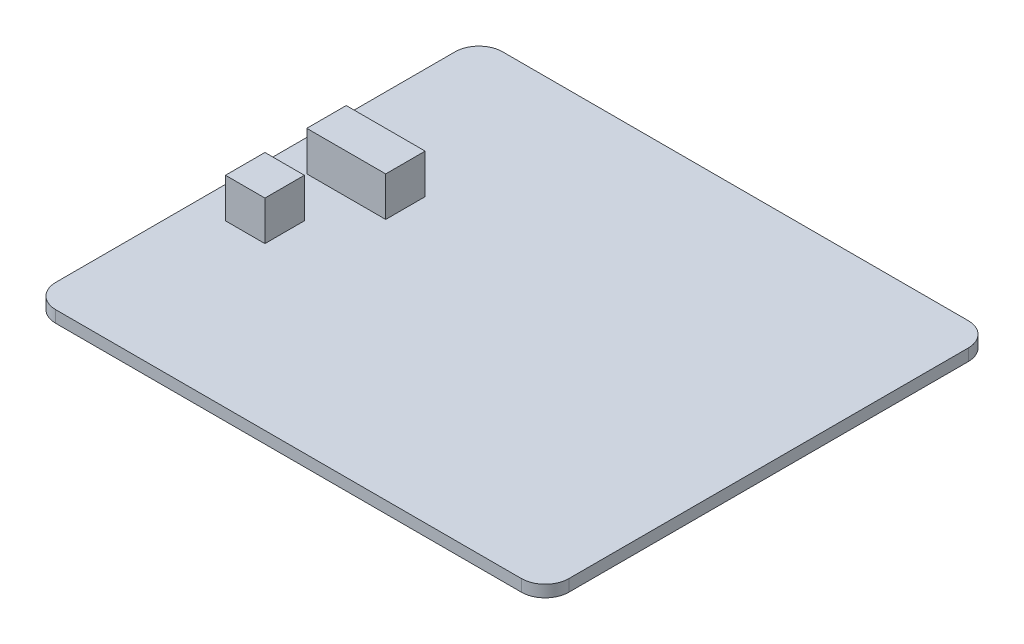
ISO-10303-21;
HEADER;
FILE_DESCRIPTION(('STEP AP214'),'2;1');
FILE_NAME('part.step','',(''),(''),'','','');
FILE_SCHEMA(('AUTOMOTIVE_DESIGN { 1 0 10303 214 1 1 1 1 }'));
ENDSEC;
DATA;
#1=APPLICATION_CONTEXT('core data for automotive mechanical design processes');
#2=APPLICATION_PROTOCOL_DEFINITION('international standard','automotive_design',2000,#1);
#3=PRODUCT_CONTEXT('',#1,'mechanical');
#4=PRODUCT('Part','Part','',(#3));
#5=PRODUCT_RELATED_PRODUCT_CATEGORY('part','',(#4));
#6=PRODUCT_DEFINITION_FORMATION('','',#4);
#7=PRODUCT_DEFINITION_CONTEXT('part definition',#1,'design');
#8=PRODUCT_DEFINITION('design','',#6,#7);
#9=PRODUCT_DEFINITION_SHAPE('','',#8);
#10=(LENGTH_UNIT() NAMED_UNIT(*) SI_UNIT(.MILLI.,.METRE.));
#11=(NAMED_UNIT(*) PLANE_ANGLE_UNIT() SI_UNIT($,.RADIAN.));
#12=(NAMED_UNIT(*) SI_UNIT($,.STERADIAN.) SOLID_ANGLE_UNIT());
#13=UNCERTAINTY_MEASURE_WITH_UNIT(LENGTH_MEASURE(1.E-05),#10,'distance_accuracy_value','');
#14=(GEOMETRIC_REPRESENTATION_CONTEXT(3) GLOBAL_UNCERTAINTY_ASSIGNED_CONTEXT((#13)) GLOBAL_UNIT_ASSIGNED_CONTEXT((#10,
#11,#12)) REPRESENTATION_CONTEXT('',''));
#15=CARTESIAN_POINT('',(0.,0.,0.));
#16=DIRECTION('',(0.,0.,1.));
#17=DIRECTION('',(1.,0.,0.));
#18=AXIS2_PLACEMENT_3D('',#15,#16,#17);
#19=CARTESIAN_POINT('',(0.,1.5,0.));
#20=DIRECTION('',(0.,-1.,0.));
#21=DIRECTION('',(0.,0.,-1.));
#22=AXIS2_PLACEMENT_3D('',#19,#20,#21);
#23=PLANE('',#22);
#24=DIRECTION('',(0.,0.,1.));
#25=VECTOR('',#24,1.);
#26=CARTESIAN_POINT('',(4.00000000000001,1.5,-25.5));
#27=LINE('',#26,#25);
#28=CARTESIAN_POINT('',(4.00000000000001,1.5,-25.5));
#29=VERTEX_POINT('',#28);
#30=CARTESIAN_POINT('',(4.00000000000001,1.5,-20.5));
#31=VERTEX_POINT('',#30);
#32=EDGE_CURVE('E168',#29,#31,#27,.T.);
#33=ORIENTED_EDGE('',*,*,#32,.F.);
#34=DIRECTION('',(-1.,0.,0.));
#35=VECTOR('',#34,1.);
#36=CARTESIAN_POINT('',(4.00000000000001,1.5,-25.5));
#37=LINE('',#36,#35);
#38=CARTESIAN_POINT('',(9.00000000000001,1.5,-25.5));
#39=VERTEX_POINT('',#38);
#40=EDGE_CURVE('E181',#39,#29,#37,.T.);
#41=ORIENTED_EDGE('',*,*,#40,.F.);
#42=DIRECTION('',(0.,0.,-1.));
#43=VECTOR('',#42,1.);
#44=CARTESIAN_POINT('',(9.00000000000001,1.5,-25.5));
#45=LINE('',#44,#43);
#46=CARTESIAN_POINT('',(9.00000000000001,1.5,-20.5));
#47=VERTEX_POINT('',#46);
#48=EDGE_CURVE('E190',#47,#39,#45,.T.);
#49=ORIENTED_EDGE('',*,*,#48,.F.);
#50=DIRECTION('',(1.,0.,0.));
#51=VECTOR('',#50,1.);
#52=CARTESIAN_POINT('',(4.00000000000001,1.5,-20.5));
#53=LINE('',#52,#51);
#54=EDGE_CURVE('E171',#31,#47,#53,.T.);
#55=ORIENTED_EDGE('',*,*,#54,.F.);
#56=EDGE_LOOP('',(#33,#41,#49,#55));
#57=FACE_BOUND('',#56,.T.);
#58=DIRECTION('',(-1.,0.,0.));
#59=VECTOR('',#58,1.);
#60=CARTESIAN_POINT('',(0.,1.5,-56.6));
#61=LINE('',#60,#59);
#62=CARTESIAN_POINT('',(62.,1.5,-56.6));
#63=VERTEX_POINT('',#62);
#64=CARTESIAN_POINT('',(3.,1.5,-56.6));
#65=VERTEX_POINT('',#64);
#66=EDGE_CURVE('E217',#63,#65,#61,.T.);
#67=ORIENTED_EDGE('',*,*,#66,.T.);
#68=CARTESIAN_POINT('',(3.,1.5,-53.6));
#69=DIRECTION('',(0.,-1.,0.));
#70=DIRECTION('',(0.,0.,-1.));
#71=AXIS2_PLACEMENT_3D('',#68,#69,#70);
#72=CIRCLE('',#71,3.);
#73=CARTESIAN_POINT('',(0.,1.5,-53.6));
#74=VERTEX_POINT('',#73);
#75=EDGE_CURVE('E254',#65,#74,#72,.F.);
#76=ORIENTED_EDGE('',*,*,#75,.T.);
#77=DIRECTION('',(0.,0.,1.));
#78=VECTOR('',#77,1.);
#79=CARTESIAN_POINT('',(0.,1.5,0.));
#80=LINE('',#79,#78);
#81=CARTESIAN_POINT('',(0.,1.5,-3.));
#82=VERTEX_POINT('',#81);
#83=EDGE_CURVE('E207',#74,#82,#80,.T.);
#84=ORIENTED_EDGE('',*,*,#83,.T.);
#85=CARTESIAN_POINT('',(3.,1.5,-3.));
#86=DIRECTION('',(0.,-1.,0.));
#87=DIRECTION('',(0.,0.,-1.));
#88=AXIS2_PLACEMENT_3D('',#85,#86,#87);
#89=CIRCLE('',#88,3.);
#90=CARTESIAN_POINT('',(3.,1.5,0.));
#91=VERTEX_POINT('',#90);
#92=EDGE_CURVE('E248',#82,#91,#89,.F.);
#93=ORIENTED_EDGE('',*,*,#92,.T.);
#94=DIRECTION('',(1.,0.,0.));
#95=VECTOR('',#94,1.);
#96=CARTESIAN_POINT('',(0.,1.5,0.));
#97=LINE('',#96,#95);
#98=CARTESIAN_POINT('',(62.,1.5,0.));
#99=VERTEX_POINT('',#98);
#100=EDGE_CURVE('E210',#91,#99,#97,.T.);
#101=ORIENTED_EDGE('',*,*,#100,.T.);
#102=CARTESIAN_POINT('',(62.,1.5,-3.));
#103=DIRECTION('',(0.,-1.,0.));
#104=DIRECTION('',(0.,0.,-1.));
#105=AXIS2_PLACEMENT_3D('',#102,#103,#104);
#106=CIRCLE('',#105,3.);
#107=CARTESIAN_POINT('',(65.,1.5,-3.));
#108=VERTEX_POINT('',#107);
#109=EDGE_CURVE('E250',#99,#108,#106,.F.);
#110=ORIENTED_EDGE('',*,*,#109,.T.);
#111=DIRECTION('',(0.,0.,-1.));
#112=VECTOR('',#111,1.);
#113=CARTESIAN_POINT('',(65.,1.5,0.));
#114=LINE('',#113,#112);
#115=CARTESIAN_POINT('',(65.,1.5,-53.6));
#116=VERTEX_POINT('',#115);
#117=EDGE_CURVE('E214',#108,#116,#114,.T.);
#118=ORIENTED_EDGE('',*,*,#117,.T.);
#119=CARTESIAN_POINT('',(62.,1.5,-53.6));
#120=DIRECTION('',(0.,-1.,0.));
#121=DIRECTION('',(0.,0.,-1.));
#122=AXIS2_PLACEMENT_3D('',#119,#120,#121);
#123=CIRCLE('',#122,3.);
#124=EDGE_CURVE('E252',#116,#63,#123,.F.);
#125=ORIENTED_EDGE('',*,*,#124,.T.);
#126=EDGE_LOOP('',(#67,#76,#84,#93,#101,#110,#118,#125));
#127=FACE_BOUND('',#126,.T.);
#128=DIRECTION('',(0.,0.,-1.));
#129=VECTOR('',#128,1.);
#130=CARTESIAN_POINT('',(14.,1.5,-35.8));
#131=LINE('',#130,#129);
#132=CARTESIAN_POINT('',(14.,1.5,-30.8));
#133=VERTEX_POINT('',#132);
#134=CARTESIAN_POINT('',(14.,1.5,-35.8));
#135=VERTEX_POINT('',#134);
#136=EDGE_CURVE('E167',#133,#135,#131,.T.);
#137=ORIENTED_EDGE('',*,*,#136,.F.);
#138=DIRECTION('',(1.,0.,0.));
#139=VECTOR('',#138,1.);
#140=CARTESIAN_POINT('',(14.,1.5,-30.8));
#141=LINE('',#140,#139);
#142=CARTESIAN_POINT('',(4.00000000000001,1.5,-30.8));
#143=VERTEX_POINT('',#142);
#144=EDGE_CURVE('E164',#143,#133,#141,.T.);
#145=ORIENTED_EDGE('',*,*,#144,.F.);
#146=DIRECTION('',(0.,0.,1.));
#147=VECTOR('',#146,1.);
#148=CARTESIAN_POINT('',(4.,1.5,-35.8));
#149=LINE('',#148,#147);
#150=CARTESIAN_POINT('',(4.,1.5,-35.8));
#151=VERTEX_POINT('',#150);
#152=EDGE_CURVE('E55',#151,#143,#149,.T.);
#153=ORIENTED_EDGE('',*,*,#152,.F.);
#154=DIRECTION('',(-1.,0.,0.));
#155=VECTOR('',#154,1.);
#156=CARTESIAN_POINT('',(14.,1.5,-35.8));
#157=LINE('',#156,#155);
#158=EDGE_CURVE('E50',#135,#151,#157,.T.);
#159=ORIENTED_EDGE('',*,*,#158,.F.);
#160=EDGE_LOOP('',(#137,#145,#153,#159));
#161=FACE_BOUND('',#160,.T.);
#162=ADVANCED_FACE('F35',(#57,#127,#161),#23,.F.);
#163=CARTESIAN_POINT('',(0.,1.5,0.));
#164=DIRECTION('',(1.,0.,0.));
#165=DIRECTION('',(0.,0.,-1.));
#166=AXIS2_PLACEMENT_3D('',#163,#164,#165);
#167=PLANE('',#166);
#168=ORIENTED_EDGE('',*,*,#83,.F.);
#169=DIRECTION('',(0.,-1.,0.));
#170=VECTOR('',#169,1.);
#171=CARTESIAN_POINT('',(0.,1.5,-53.6));
#172=LINE('',#171,#170);
#173=CARTESIAN_POINT('',(0.,0.,-53.6));
#174=VERTEX_POINT('',#173);
#175=EDGE_CURVE('E232',#74,#174,#172,.T.);
#176=ORIENTED_EDGE('',*,*,#175,.T.);
#177=DIRECTION('',(0.,0.,1.));
#178=VECTOR('',#177,1.);
#179=CARTESIAN_POINT('',(0.,0.,0.));
#180=LINE('',#179,#178);
#181=CARTESIAN_POINT('',(0.,0.,-3.));
#182=VERTEX_POINT('',#181);
#183=EDGE_CURVE('E206',#174,#182,#180,.T.);
#184=ORIENTED_EDGE('',*,*,#183,.T.);
#185=DIRECTION('',(0.,-1.,0.));
#186=VECTOR('',#185,1.);
#187=CARTESIAN_POINT('',(0.,1.5,-3.));
#188=LINE('',#187,#186);
#189=EDGE_CURVE('E220',#182,#82,#188,.F.);
#190=ORIENTED_EDGE('',*,*,#189,.T.);
#191=EDGE_LOOP('',(#168,#176,#184,#190));
#192=FACE_BOUND('',#191,.T.);
#193=ADVANCED_FACE('F297',(#192),#167,.F.);
#194=CARTESIAN_POINT('',(0.,1.5,0.));
#195=DIRECTION('',(0.,0.,-1.));
#196=DIRECTION('',(-1.,0.,0.));
#197=AXIS2_PLACEMENT_3D('',#194,#195,#196);
#198=PLANE('',#197);
#199=DIRECTION('',(1.,0.,0.));
#200=VECTOR('',#199,1.);
#201=CARTESIAN_POINT('',(0.,0.,0.));
#202=LINE('',#201,#200);
#203=CARTESIAN_POINT('',(3.,0.,0.));
#204=VERTEX_POINT('',#203);
#205=CARTESIAN_POINT('',(62.,0.,0.));
#206=VERTEX_POINT('',#205);
#207=EDGE_CURVE('E223',#204,#206,#202,.T.);
#208=ORIENTED_EDGE('',*,*,#207,.T.);
#209=DIRECTION('',(0.,-1.,0.));
#210=VECTOR('',#209,1.);
#211=CARTESIAN_POINT('',(62.,1.5,0.));
#212=LINE('',#211,#210);
#213=EDGE_CURVE('E11',#206,#99,#212,.F.);
#214=ORIENTED_EDGE('',*,*,#213,.T.);
#215=ORIENTED_EDGE('',*,*,#100,.F.);
#216=DIRECTION('',(0.,-1.,0.));
#217=VECTOR('',#216,1.);
#218=CARTESIAN_POINT('',(3.,1.5,0.));
#219=LINE('',#218,#217);
#220=EDGE_CURVE('E43',#91,#204,#219,.T.);
#221=ORIENTED_EDGE('',*,*,#220,.T.);
#222=EDGE_LOOP('',(#208,#214,#215,#221));
#223=FACE_BOUND('',#222,.T.);
#224=ADVANCED_FACE('F265',(#223),#198,.F.);
#225=CARTESIAN_POINT('',(65.,1.5,0.));
#226=DIRECTION('',(-1.,0.,0.));
#227=DIRECTION('',(0.,0.,1.));
#228=AXIS2_PLACEMENT_3D('',#225,#226,#227);
#229=PLANE('',#228);
#230=DIRECTION('',(0.,0.,-1.));
#231=VECTOR('',#230,1.);
#232=CARTESIAN_POINT('',(65.,0.,0.));
#233=LINE('',#232,#231);
#234=CARTESIAN_POINT('',(65.,0.,-3.));
#235=VERTEX_POINT('',#234);
#236=CARTESIAN_POINT('',(65.,0.,-53.6));
#237=VERTEX_POINT('',#236);
#238=EDGE_CURVE('E226',#235,#237,#233,.T.);
#239=ORIENTED_EDGE('',*,*,#238,.T.);
#240=DIRECTION('',(0.,-1.,0.));
#241=VECTOR('',#240,1.);
#242=CARTESIAN_POINT('',(65.,1.5,-53.6));
#243=LINE('',#242,#241);
#244=EDGE_CURVE('E259',#237,#116,#243,.F.);
#245=ORIENTED_EDGE('',*,*,#244,.T.);
#246=ORIENTED_EDGE('',*,*,#117,.F.);
#247=DIRECTION('',(0.,-1.,0.));
#248=VECTOR('',#247,1.);
#249=CARTESIAN_POINT('',(65.,1.5,-3.));
#250=LINE('',#249,#248);
#251=EDGE_CURVE('E256',#108,#235,#250,.T.);
#252=ORIENTED_EDGE('',*,*,#251,.T.);
#253=EDGE_LOOP('',(#239,#245,#246,#252));
#254=FACE_BOUND('',#253,.T.);
#255=ADVANCED_FACE('F279',(#254),#229,.F.);
#256=CARTESIAN_POINT('',(0.,1.5,-56.6));
#257=DIRECTION('',(0.,0.,1.));
#258=DIRECTION('',(1.,0.,0.));
#259=AXIS2_PLACEMENT_3D('',#256,#257,#258);
#260=PLANE('',#259);
#261=DIRECTION('',(-1.,0.,0.));
#262=VECTOR('',#261,1.);
#263=CARTESIAN_POINT('',(0.,0.,-56.6));
#264=LINE('',#263,#262);
#265=CARTESIAN_POINT('',(62.,0.,-56.6));
#266=VERTEX_POINT('',#265);
#267=CARTESIAN_POINT('',(3.,0.,-56.6));
#268=VERTEX_POINT('',#267);
#269=EDGE_CURVE('E211',#266,#268,#264,.T.);
#270=ORIENTED_EDGE('',*,*,#269,.T.);
#271=DIRECTION('',(0.,-1.,0.));
#272=VECTOR('',#271,1.);
#273=CARTESIAN_POINT('',(3.,1.5,-56.6));
#274=LINE('',#273,#272);
#275=EDGE_CURVE('E246',#268,#65,#274,.F.);
#276=ORIENTED_EDGE('',*,*,#275,.T.);
#277=ORIENTED_EDGE('',*,*,#66,.F.);
#278=DIRECTION('',(0.,-1.,0.));
#279=VECTOR('',#278,1.);
#280=CARTESIAN_POINT('',(62.,1.5,-56.6));
#281=LINE('',#280,#279);
#282=EDGE_CURVE('E243',#63,#266,#281,.T.);
#283=ORIENTED_EDGE('',*,*,#282,.T.);
#284=EDGE_LOOP('',(#270,#276,#277,#283));
#285=FACE_BOUND('',#284,.T.);
#286=ADVANCED_FACE('F289',(#285),#260,.F.);
#287=CARTESIAN_POINT('',(0.,0.,0.));
#288=DIRECTION('',(0.,-1.,0.));
#289=DIRECTION('',(0.,0.,-1.));
#290=AXIS2_PLACEMENT_3D('',#287,#288,#289);
#291=PLANE('',#290);
#292=ORIENTED_EDGE('',*,*,#183,.F.);
#293=CARTESIAN_POINT('',(3.,0.,-53.6));
#294=DIRECTION('',(0.,-1.,0.));
#295=DIRECTION('',(0.,0.,-1.));
#296=AXIS2_PLACEMENT_3D('',#293,#294,#295);
#297=CIRCLE('',#296,3.);
#298=EDGE_CURVE('E241',#174,#268,#297,.T.);
#299=ORIENTED_EDGE('',*,*,#298,.T.);
#300=ORIENTED_EDGE('',*,*,#269,.F.);
#301=CARTESIAN_POINT('',(62.,0.,-53.6));
#302=DIRECTION('',(0.,-1.,0.));
#303=DIRECTION('',(0.,0.,-1.));
#304=AXIS2_PLACEMENT_3D('',#301,#302,#303);
#305=CIRCLE('',#304,3.);
#306=EDGE_CURVE('E239',#266,#237,#305,.T.);
#307=ORIENTED_EDGE('',*,*,#306,.T.);
#308=ORIENTED_EDGE('',*,*,#238,.F.);
#309=CARTESIAN_POINT('',(62.,0.,-3.));
#310=DIRECTION('',(0.,-1.,0.));
#311=DIRECTION('',(0.,0.,-1.));
#312=AXIS2_PLACEMENT_3D('',#309,#310,#311);
#313=CIRCLE('',#312,3.);
#314=EDGE_CURVE('E237',#235,#206,#313,.T.);
#315=ORIENTED_EDGE('',*,*,#314,.T.);
#316=ORIENTED_EDGE('',*,*,#207,.F.);
#317=CARTESIAN_POINT('',(3.,0.,-3.));
#318=DIRECTION('',(0.,-1.,0.));
#319=DIRECTION('',(0.,0.,-1.));
#320=AXIS2_PLACEMENT_3D('',#317,#318,#319);
#321=CIRCLE('',#320,3.);
#322=EDGE_CURVE('E235',#204,#182,#321,.T.);
#323=ORIENTED_EDGE('',*,*,#322,.T.);
#324=EDGE_LOOP('',(#292,#299,#300,#307,#308,#315,#316,#323));
#325=FACE_BOUND('',#324,.T.);
#326=ADVANCED_FACE('F271',(#325),#291,.T.);
#327=CARTESIAN_POINT('',(3.,1.5,-53.6));
#328=DIRECTION('',(0.,-1.,0.));
#329=DIRECTION('',(0.,0.,-1.));
#330=AXIS2_PLACEMENT_3D('',#327,#328,#329);
#331=CYLINDRICAL_SURFACE('',#330,3.);
#332=ORIENTED_EDGE('',*,*,#75,.F.);
#333=ORIENTED_EDGE('',*,*,#275,.F.);
#334=ORIENTED_EDGE('',*,*,#298,.F.);
#335=ORIENTED_EDGE('',*,*,#175,.F.);
#336=EDGE_LOOP('',(#332,#333,#334,#335));
#337=FACE_BOUND('',#336,.T.);
#338=ADVANCED_FACE('F294',(#337),#331,.T.);
#339=CARTESIAN_POINT('',(62.,1.5,-53.6));
#340=DIRECTION('',(0.,-1.,0.));
#341=DIRECTION('',(0.,0.,-1.));
#342=AXIS2_PLACEMENT_3D('',#339,#340,#341);
#343=CYLINDRICAL_SURFACE('',#342,3.);
#344=ORIENTED_EDGE('',*,*,#124,.F.);
#345=ORIENTED_EDGE('',*,*,#244,.F.);
#346=ORIENTED_EDGE('',*,*,#306,.F.);
#347=ORIENTED_EDGE('',*,*,#282,.F.);
#348=EDGE_LOOP('',(#344,#345,#346,#347));
#349=FACE_BOUND('',#348,.T.);
#350=ADVANCED_FACE('F286',(#349),#343,.T.);
#351=CARTESIAN_POINT('',(62.,1.5,-3.));
#352=DIRECTION('',(0.,-1.,0.));
#353=DIRECTION('',(0.,0.,-1.));
#354=AXIS2_PLACEMENT_3D('',#351,#352,#353);
#355=CYLINDRICAL_SURFACE('',#354,3.);
#356=ORIENTED_EDGE('',*,*,#109,.F.);
#357=ORIENTED_EDGE('',*,*,#213,.F.);
#358=ORIENTED_EDGE('',*,*,#314,.F.);
#359=ORIENTED_EDGE('',*,*,#251,.F.);
#360=EDGE_LOOP('',(#356,#357,#358,#359));
#361=FACE_BOUND('',#360,.T.);
#362=ADVANCED_FACE('F276',(#361),#355,.T.);
#363=CARTESIAN_POINT('',(3.,1.5,-3.));
#364=DIRECTION('',(0.,-1.,0.));
#365=DIRECTION('',(0.,0.,-1.));
#366=AXIS2_PLACEMENT_3D('',#363,#364,#365);
#367=CYLINDRICAL_SURFACE('',#366,3.);
#368=ORIENTED_EDGE('',*,*,#92,.F.);
#369=ORIENTED_EDGE('',*,*,#189,.F.);
#370=ORIENTED_EDGE('',*,*,#322,.F.);
#371=ORIENTED_EDGE('',*,*,#220,.F.);
#372=EDGE_LOOP('',(#368,#369,#370,#371));
#373=FACE_BOUND('',#372,.T.);
#374=ADVANCED_FACE('F37',(#373),#367,.T.);
#375=CARTESIAN_POINT('',(4.00000000000001,6.5,-25.5));
#376=DIRECTION('',(1.,0.,0.));
#377=DIRECTION('',(0.,0.,-1.));
#378=AXIS2_PLACEMENT_3D('',#375,#376,#377);
#379=PLANE('',#378);
#380=ORIENTED_EDGE('',*,*,#32,.T.);
#381=DIRECTION('',(0.,-1.,0.));
#382=VECTOR('',#381,1.);
#383=CARTESIAN_POINT('',(4.00000000000001,6.5,-20.5));
#384=LINE('',#383,#382);
#385=CARTESIAN_POINT('',(4.00000000000001,6.5,-20.5));
#386=VERTEX_POINT('',#385);
#387=EDGE_CURVE('E203',#386,#31,#384,.T.);
#388=ORIENTED_EDGE('',*,*,#387,.F.);
#389=DIRECTION('',(0.,0.,1.));
#390=VECTOR('',#389,1.);
#391=CARTESIAN_POINT('',(4.00000000000001,6.5,-25.5));
#392=LINE('',#391,#390);
#393=CARTESIAN_POINT('',(4.00000000000001,6.5,-25.5));
#394=VERTEX_POINT('',#393);
#395=EDGE_CURVE('E177',#394,#386,#392,.T.);
#396=ORIENTED_EDGE('',*,*,#395,.F.);
#397=DIRECTION('',(0.,-1.,0.));
#398=VECTOR('',#397,1.);
#399=CARTESIAN_POINT('',(4.00000000000001,6.5,-25.5));
#400=LINE('',#399,#398);
#401=EDGE_CURVE('E186',#394,#29,#400,.T.);
#402=ORIENTED_EDGE('',*,*,#401,.T.);
#403=EDGE_LOOP('',(#380,#388,#396,#402));
#404=FACE_BOUND('',#403,.T.);
#405=ADVANCED_FACE('F300',(#404),#379,.F.);
#406=CARTESIAN_POINT('',(4.00000000000001,6.5,-20.5));
#407=DIRECTION('',(0.,0.,-1.));
#408=DIRECTION('',(-1.,0.,0.));
#409=AXIS2_PLACEMENT_3D('',#406,#407,#408);
#410=PLANE('',#409);
#411=ORIENTED_EDGE('',*,*,#54,.T.);
#412=DIRECTION('',(0.,-1.,0.));
#413=VECTOR('',#412,1.);
#414=CARTESIAN_POINT('',(9.00000000000001,6.5,-20.5));
#415=LINE('',#414,#413);
#416=CARTESIAN_POINT('',(9.00000000000001,6.5,-20.5));
#417=VERTEX_POINT('',#416);
#418=EDGE_CURVE('E200',#417,#47,#415,.T.);
#419=ORIENTED_EDGE('',*,*,#418,.F.);
#420=DIRECTION('',(1.,0.,0.));
#421=VECTOR('',#420,1.);
#422=CARTESIAN_POINT('',(4.00000000000001,6.5,-20.5));
#423=LINE('',#422,#421);
#424=EDGE_CURVE('E180',#386,#417,#423,.T.);
#425=ORIENTED_EDGE('',*,*,#424,.F.);
#426=ORIENTED_EDGE('',*,*,#387,.T.);
#427=EDGE_LOOP('',(#411,#419,#425,#426));
#428=FACE_BOUND('',#427,.T.);
#429=ADVANCED_FACE('F305',(#428),#410,.F.);
#430=CARTESIAN_POINT('',(9.00000000000001,6.5,-25.5));
#431=DIRECTION('',(-1.,0.,0.));
#432=DIRECTION('',(0.,0.,1.));
#433=AXIS2_PLACEMENT_3D('',#430,#431,#432);
#434=PLANE('',#433);
#435=ORIENTED_EDGE('',*,*,#48,.T.);
#436=DIRECTION('',(0.,-1.,0.));
#437=VECTOR('',#436,1.);
#438=CARTESIAN_POINT('',(9.00000000000001,6.5,-25.5));
#439=LINE('',#438,#437);
#440=CARTESIAN_POINT('',(9.00000000000001,6.5,-25.5));
#441=VERTEX_POINT('',#440);
#442=EDGE_CURVE('E197',#441,#39,#439,.T.);
#443=ORIENTED_EDGE('',*,*,#442,.F.);
#444=DIRECTION('',(0.,0.,-1.));
#445=VECTOR('',#444,1.);
#446=CARTESIAN_POINT('',(9.00000000000001,6.5,-25.5));
#447=LINE('',#446,#445);
#448=EDGE_CURVE('E183',#417,#441,#447,.T.);
#449=ORIENTED_EDGE('',*,*,#448,.F.);
#450=ORIENTED_EDGE('',*,*,#418,.T.);
#451=EDGE_LOOP('',(#435,#443,#449,#450));
#452=FACE_BOUND('',#451,.T.);
#453=ADVANCED_FACE('F359',(#452),#434,.F.);
#454=CARTESIAN_POINT('',(4.00000000000001,6.5,-25.5));
#455=DIRECTION('',(0.,0.,1.));
#456=DIRECTION('',(1.,0.,0.));
#457=AXIS2_PLACEMENT_3D('',#454,#455,#456);
#458=PLANE('',#457);
#459=ORIENTED_EDGE('',*,*,#40,.T.);
#460=ORIENTED_EDGE('',*,*,#401,.F.);
#461=DIRECTION('',(-1.,0.,0.));
#462=VECTOR('',#461,1.);
#463=CARTESIAN_POINT('',(4.00000000000001,6.5,-25.5));
#464=LINE('',#463,#462);
#465=EDGE_CURVE('E185',#441,#394,#464,.T.);
#466=ORIENTED_EDGE('',*,*,#465,.F.);
#467=ORIENTED_EDGE('',*,*,#442,.T.);
#468=EDGE_LOOP('',(#459,#460,#466,#467));
#469=FACE_BOUND('',#468,.T.);
#470=ADVANCED_FACE('F368',(#469),#458,.F.);
#471=CARTESIAN_POINT('',(0.,6.5,0.));
#472=DIRECTION('',(0.,1.,0.));
#473=DIRECTION('',(0.,0.,1.));
#474=AXIS2_PLACEMENT_3D('',#471,#472,#473);
#475=PLANE('',#474);
#476=ORIENTED_EDGE('',*,*,#395,.T.);
#477=ORIENTED_EDGE('',*,*,#424,.T.);
#478=ORIENTED_EDGE('',*,*,#448,.T.);
#479=ORIENTED_EDGE('',*,*,#465,.T.);
#480=EDGE_LOOP('',(#476,#477,#478,#479));
#481=FACE_BOUND('',#480,.T.);
#482=ADVANCED_FACE('F378',(#481),#475,.T.);
#483=CARTESIAN_POINT('',(14.,6.5,-35.8));
#484=DIRECTION('',(-1.,0.,0.));
#485=DIRECTION('',(0.,0.,1.));
#486=AXIS2_PLACEMENT_3D('',#483,#484,#485);
#487=PLANE('',#486);
#488=ORIENTED_EDGE('',*,*,#136,.T.);
#489=DIRECTION('',(0.,-1.,0.));
#490=VECTOR('',#489,1.);
#491=CARTESIAN_POINT('',(14.,6.5,-35.8));
#492=LINE('',#491,#490);
#493=CARTESIAN_POINT('',(14.,6.5,-35.8));
#494=VERTEX_POINT('',#493);
#495=EDGE_CURVE('E148',#494,#135,#492,.T.);
#496=ORIENTED_EDGE('',*,*,#495,.F.);
#497=DIRECTION('',(0.,0.,-1.));
#498=VECTOR('',#497,1.);
#499=CARTESIAN_POINT('',(14.,6.5,-35.8));
#500=LINE('',#499,#498);
#501=CARTESIAN_POINT('',(14.,6.5,-30.8));
#502=VERTEX_POINT('',#501);
#503=EDGE_CURVE('E155',#502,#494,#500,.T.);
#504=ORIENTED_EDGE('',*,*,#503,.F.);
#505=DIRECTION('',(0.,-1.,0.));
#506=VECTOR('',#505,1.);
#507=CARTESIAN_POINT('',(14.,6.5,-30.8));
#508=LINE('',#507,#506);
#509=EDGE_CURVE('E438',#502,#133,#508,.T.);
#510=ORIENTED_EDGE('',*,*,#509,.T.);
#511=EDGE_LOOP('',(#488,#496,#504,#510));
#512=FACE_BOUND('',#511,.T.);
#513=ADVANCED_FACE('F166',(#512),#487,.F.);
#514=CARTESIAN_POINT('',(14.,6.5,-35.8));
#515=DIRECTION('',(0.,0.,1.));
#516=DIRECTION('',(1.,0.,0.));
#517=AXIS2_PLACEMENT_3D('',#514,#515,#516);
#518=PLANE('',#517);
#519=ORIENTED_EDGE('',*,*,#158,.T.);
#520=DIRECTION('',(0.,-1.,0.));
#521=VECTOR('',#520,1.);
#522=CARTESIAN_POINT('',(4.,6.5,-35.8));
#523=LINE('',#522,#521);
#524=CARTESIAN_POINT('',(4.,6.5,-35.8));
#525=VERTEX_POINT('',#524);
#526=EDGE_CURVE('E151',#525,#151,#523,.T.);
#527=ORIENTED_EDGE('',*,*,#526,.F.);
#528=DIRECTION('',(-1.,0.,0.));
#529=VECTOR('',#528,1.);
#530=CARTESIAN_POINT('',(14.,6.5,-35.8));
#531=LINE('',#530,#529);
#532=EDGE_CURVE('E144',#494,#525,#531,.T.);
#533=ORIENTED_EDGE('',*,*,#532,.F.);
#534=ORIENTED_EDGE('',*,*,#495,.T.);
#535=EDGE_LOOP('',(#519,#527,#533,#534));
#536=FACE_BOUND('',#535,.T.);
#537=ADVANCED_FACE('F146',(#536),#518,.F.);
#538=CARTESIAN_POINT('',(4.,6.5,-35.8));
#539=DIRECTION('',(1.,0.,0.));
#540=DIRECTION('',(0.,0.,-1.));
#541=AXIS2_PLACEMENT_3D('',#538,#539,#540);
#542=PLANE('',#541);
#543=ORIENTED_EDGE('',*,*,#152,.T.);
#544=DIRECTION('',(0.,-1.,0.));
#545=VECTOR('',#544,1.);
#546=CARTESIAN_POINT('',(4.00000000000001,6.5,-30.8));
#547=LINE('',#546,#545);
#548=CARTESIAN_POINT('',(4.00000000000001,6.5,-30.8));
#549=VERTEX_POINT('',#548);
#550=EDGE_CURVE('E173',#549,#143,#547,.T.);
#551=ORIENTED_EDGE('',*,*,#550,.F.);
#552=DIRECTION('',(0.,0.,1.));
#553=VECTOR('',#552,1.);
#554=CARTESIAN_POINT('',(4.,6.5,-35.8));
#555=LINE('',#554,#553);
#556=EDGE_CURVE('E154',#525,#549,#555,.T.);
#557=ORIENTED_EDGE('',*,*,#556,.F.);
#558=ORIENTED_EDGE('',*,*,#526,.T.);
#559=EDGE_LOOP('',(#543,#551,#557,#558));
#560=FACE_BOUND('',#559,.T.);
#561=ADVANCED_FACE('F405',(#560),#542,.F.);
#562=CARTESIAN_POINT('',(14.,6.5,-30.8));
#563=DIRECTION('',(0.,0.,-1.));
#564=DIRECTION('',(-1.,0.,0.));
#565=AXIS2_PLACEMENT_3D('',#562,#563,#564);
#566=PLANE('',#565);
#567=ORIENTED_EDGE('',*,*,#144,.T.);
#568=ORIENTED_EDGE('',*,*,#509,.F.);
#569=DIRECTION('',(1.,0.,0.));
#570=VECTOR('',#569,1.);
#571=CARTESIAN_POINT('',(14.,6.5,-30.8));
#572=LINE('',#571,#570);
#573=EDGE_CURVE('E160',#549,#502,#572,.T.);
#574=ORIENTED_EDGE('',*,*,#573,.F.);
#575=ORIENTED_EDGE('',*,*,#550,.T.);
#576=EDGE_LOOP('',(#567,#568,#574,#575));
#577=FACE_BOUND('',#576,.T.);
#578=ADVANCED_FACE('F414',(#577),#566,.F.);
#579=CARTESIAN_POINT('',(0.,6.5,0.));
#580=DIRECTION('',(0.,-1.,0.));
#581=DIRECTION('',(0.,0.,-1.));
#582=AXIS2_PLACEMENT_3D('',#579,#580,#581);
#583=PLANE('',#582);
#584=ORIENTED_EDGE('',*,*,#503,.T.);
#585=ORIENTED_EDGE('',*,*,#532,.T.);
#586=ORIENTED_EDGE('',*,*,#556,.T.);
#587=ORIENTED_EDGE('',*,*,#573,.T.);
#588=EDGE_LOOP('',(#584,#585,#586,#587));
#589=FACE_BOUND('',#588,.T.);
#590=ADVANCED_FACE('F158',(#589),#583,.F.);
#591=CLOSED_SHELL('',(#162,#193,#224,#255,#286,#326,#338,#350,#362,#374,#405,#429,#453,#470,
#482,#513,#537,#561,#578,#590));
#592=MANIFOLD_SOLID_BREP('B2',#591);
#593=ADVANCED_BREP_SHAPE_REPRESENTATION('',(#18,#592),#14);
#594=SHAPE_DEFINITION_REPRESENTATION(#9,#593);
ENDSEC;
END-ISO-10303-21;
